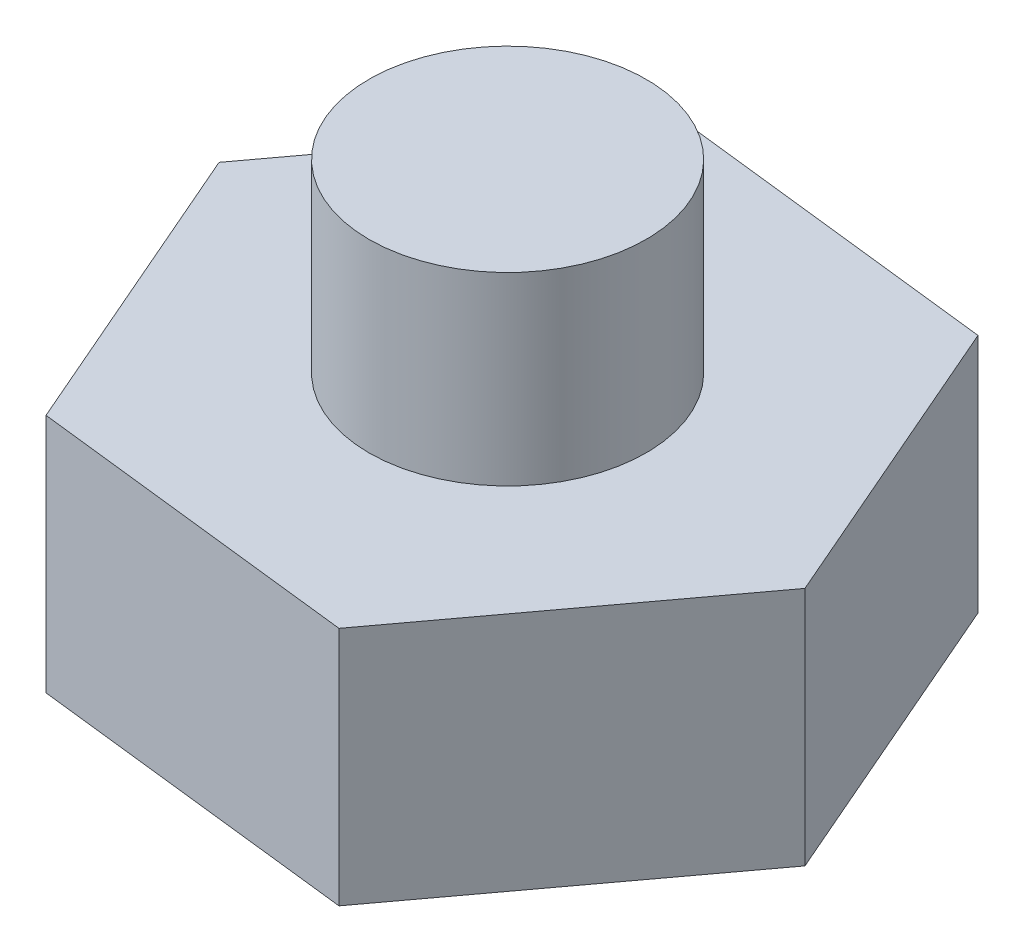
ISO-10303-21;
HEADER;
FILE_DESCRIPTION(('STEP AP214'),'2;1');
FILE_NAME('part.step','',(''),(''),'','','');
FILE_SCHEMA(('AUTOMOTIVE_DESIGN { 1 0 10303 214 1 1 1 1 }'));
ENDSEC;
DATA;
#1=APPLICATION_CONTEXT('core data for automotive mechanical design processes');
#2=APPLICATION_PROTOCOL_DEFINITION('international standard','automotive_design',2000,#1);
#3=PRODUCT_CONTEXT('',#1,'mechanical');
#4=PRODUCT('Part','Part','',(#3));
#5=PRODUCT_RELATED_PRODUCT_CATEGORY('part','',(#4));
#6=PRODUCT_DEFINITION_FORMATION('','',#4);
#7=PRODUCT_DEFINITION_CONTEXT('part definition',#1,'design');
#8=PRODUCT_DEFINITION('design','',#6,#7);
#9=PRODUCT_DEFINITION_SHAPE('','',#8);
#10=(LENGTH_UNIT() NAMED_UNIT(*) SI_UNIT(.MILLI.,.METRE.));
#11=(NAMED_UNIT(*) PLANE_ANGLE_UNIT() SI_UNIT($,.RADIAN.));
#12=(NAMED_UNIT(*) SI_UNIT($,.STERADIAN.) SOLID_ANGLE_UNIT());
#13=UNCERTAINTY_MEASURE_WITH_UNIT(LENGTH_MEASURE(1.E-05),#10,'distance_accuracy_value','');
#14=(GEOMETRIC_REPRESENTATION_CONTEXT(3) GLOBAL_UNCERTAINTY_ASSIGNED_CONTEXT((#13)) GLOBAL_UNIT_ASSIGNED_CONTEXT((#10,
#11,#12)) REPRESENTATION_CONTEXT('',''));
#15=CARTESIAN_POINT('',(0.,0.,0.));
#16=DIRECTION('',(0.,0.,1.));
#17=DIRECTION('',(1.,0.,0.));
#18=AXIS2_PLACEMENT_3D('',#15,#16,#17);
#19=CARTESIAN_POINT('',(0.,65.,0.));
#20=DIRECTION('',(0.,1.,0.));
#21=DIRECTION('',(0.,0.,1.));
#22=AXIS2_PLACEMENT_3D('',#19,#20,#21);
#23=PLANE('',#22);
#24=DIRECTION('',(0.993472129795685,0.,0.114075095087512));
#25=VECTOR('',#24,1.);
#26=CARTESIAN_POINT('',(-53.6499756463404,65.,72.3708703035115));
#27=LINE('',#26,#25);
#28=CARTESIAN_POINT('',(-53.6499756463404,65.,72.3708703035115));
#29=VERTEX_POINT('',#28);
#30=CARTESIAN_POINT('',(35.8500243536596,65.,82.647676973903));
#31=VERTEX_POINT('',#30);
#32=EDGE_CURVE('E129',#29,#31,#27,.T.);
#33=ORIENTED_EDGE('',*,*,#32,.T.);
#34=DIRECTION('',(0.595527995182753,0.,-0.803334554811139));
#35=VECTOR('',#34,1.);
#36=CARTESIAN_POINT('',(35.8500243536596,65.,82.647676973903));
#37=LINE('',#36,#35);
#38=CARTESIAN_POINT('',(89.5,65.,10.2768066703915));
#39=VERTEX_POINT('',#38);
#40=EDGE_CURVE('E87',#31,#39,#37,.T.);
#41=ORIENTED_EDGE('',*,*,#40,.T.);
#42=DIRECTION('',(-0.397944134612931,0.,-0.917409649898651));
#43=VECTOR('',#42,1.);
#44=CARTESIAN_POINT('',(89.5,65.,10.2768066703915));
#45=LINE('',#44,#43);
#46=CARTESIAN_POINT('',(53.6499756463405,65.,-72.3708703035115));
#47=VERTEX_POINT('',#46);
#48=EDGE_CURVE('E100',#39,#47,#45,.T.);
#49=ORIENTED_EDGE('',*,*,#48,.T.);
#50=DIRECTION('',(-0.993472129795685,0.,-0.114075095087512));
#51=VECTOR('',#50,1.);
#52=CARTESIAN_POINT('',(53.6499756463405,65.,-72.3708703035115));
#53=LINE('',#52,#51);
#54=CARTESIAN_POINT('',(-35.8500243536596,65.,-82.647676973903));
#55=VERTEX_POINT('',#54);
#56=EDGE_CURVE('E94',#47,#55,#53,.T.);
#57=ORIENTED_EDGE('',*,*,#56,.T.);
#58=DIRECTION('',(-0.595527995182753,0.,0.803334554811139));
#59=VECTOR('',#58,1.);
#60=CARTESIAN_POINT('',(-35.8500243536596,65.,-82.647676973903));
#61=LINE('',#60,#59);
#62=CARTESIAN_POINT('',(-89.5,65.,-10.2768066703915));
#63=VERTEX_POINT('',#62);
#64=EDGE_CURVE('E98',#55,#63,#61,.T.);
#65=ORIENTED_EDGE('',*,*,#64,.T.);
#66=DIRECTION('',(0.397944134612931,0.,0.917409649898651));
#67=VECTOR('',#66,1.);
#68=CARTESIAN_POINT('',(-89.5,65.,-10.2768066703915));
#69=LINE('',#68,#67);
#70=EDGE_CURVE('E50',#63,#29,#69,.T.);
#71=ORIENTED_EDGE('',*,*,#70,.T.);
#72=EDGE_LOOP('',(#33,#41,#49,#57,#65,#71));
#73=FACE_BOUND('',#72,.T.);
#74=CARTESIAN_POINT('',(-1.19152273757772,65.,0.));
#75=DIRECTION('',(0.,1.,0.));
#76=DIRECTION('',(0.,0.,1.));
#77=AXIS2_PLACEMENT_3D('',#74,#75,#76);
#78=CIRCLE('',#77,37.5);
#79=CARTESIAN_POINT('',(-1.19152273757772,65.,37.5));
#80=VERTEX_POINT('',#79);
#81=EDGE_CURVE('E122',#80,#80,#78,.T.);
#82=ORIENTED_EDGE('',*,*,#81,.F.);
#83=EDGE_LOOP('',(#82));
#84=FACE_BOUND('',#83,.T.);
#85=ADVANCED_FACE('F33',(#73,#84),#23,.T.);
#86=CARTESIAN_POINT('',(0.,0.,0.));
#87=DIRECTION('',(0.,1.,0.));
#88=DIRECTION('',(0.,0.,1.));
#89=AXIS2_PLACEMENT_3D('',#86,#87,#88);
#90=PLANE('',#89);
#91=DIRECTION('',(0.993472129795685,0.,0.114075095087512));
#92=VECTOR('',#91,1.);
#93=CARTESIAN_POINT('',(-53.6499756463404,0.,72.3708703035115));
#94=LINE('',#93,#92);
#95=CARTESIAN_POINT('',(-53.6499756463404,0.,72.3708703035115));
#96=VERTEX_POINT('',#95);
#97=CARTESIAN_POINT('',(35.8500243536596,0.,82.647676973903));
#98=VERTEX_POINT('',#97);
#99=EDGE_CURVE('E118',#96,#98,#94,.T.);
#100=ORIENTED_EDGE('',*,*,#99,.F.);
#101=DIRECTION('',(0.397944134612931,0.,0.917409649898651));
#102=VECTOR('',#101,1.);
#103=CARTESIAN_POINT('',(-89.5,0.,-10.2768066703915));
#104=LINE('',#103,#102);
#105=CARTESIAN_POINT('',(-89.5,0.,-10.2768066703915));
#106=VERTEX_POINT('',#105);
#107=EDGE_CURVE('E79',#106,#96,#104,.T.);
#108=ORIENTED_EDGE('',*,*,#107,.F.);
#109=DIRECTION('',(-0.595527995182753,0.,0.803334554811139));
#110=VECTOR('',#109,1.);
#111=CARTESIAN_POINT('',(-35.8500243536596,0.,-82.647676973903));
#112=LINE('',#111,#110);
#113=CARTESIAN_POINT('',(-35.8500243536596,0.,-82.647676973903));
#114=VERTEX_POINT('',#113);
#115=EDGE_CURVE('E73',#114,#106,#112,.T.);
#116=ORIENTED_EDGE('',*,*,#115,.F.);
#117=DIRECTION('',(-0.993472129795685,0.,-0.114075095087512));
#118=VECTOR('',#117,1.);
#119=CARTESIAN_POINT('',(53.6499756463405,0.,-72.3708703035115));
#120=LINE('',#119,#118);
#121=CARTESIAN_POINT('',(53.6499756463405,0.,-72.3708703035115));
#122=VERTEX_POINT('',#121);
#123=EDGE_CURVE('E108',#122,#114,#120,.T.);
#124=ORIENTED_EDGE('',*,*,#123,.F.);
#125=DIRECTION('',(-0.397944134612931,0.,-0.917409649898651));
#126=VECTOR('',#125,1.);
#127=CARTESIAN_POINT('',(89.5,0.,10.2768066703915));
#128=LINE('',#127,#126);
#129=CARTESIAN_POINT('',(89.5,0.,10.2768066703915));
#130=VERTEX_POINT('',#129);
#131=EDGE_CURVE('E124',#130,#122,#128,.T.);
#132=ORIENTED_EDGE('',*,*,#131,.F.);
#133=DIRECTION('',(0.595527995182753,0.,-0.803334554811139));
#134=VECTOR('',#133,1.);
#135=CARTESIAN_POINT('',(35.8500243536596,0.,82.647676973903));
#136=LINE('',#135,#134);
#137=EDGE_CURVE('E121',#98,#130,#136,.T.);
#138=ORIENTED_EDGE('',*,*,#137,.F.);
#139=EDGE_LOOP('',(#100,#108,#116,#124,#132,#138));
#140=FACE_BOUND('',#139,.T.);
#141=ADVANCED_FACE('F138',(#140),#90,.F.);
#142=CARTESIAN_POINT('',(-53.6499756463404,65.,72.3708703035115));
#143=DIRECTION('',(0.114075095087512,0.,-0.993472129795685));
#144=DIRECTION('',(-0.993472129795685,0.,-0.114075095087512));
#145=AXIS2_PLACEMENT_3D('',#142,#143,#144);
#146=PLANE('',#145);
#147=ORIENTED_EDGE('',*,*,#99,.T.);
#148=DIRECTION('',(0.,-1.,0.));
#149=VECTOR('',#148,1.);
#150=CARTESIAN_POINT('',(35.8500243536596,65.,82.647676973903));
#151=LINE('',#150,#149);
#152=EDGE_CURVE('E11',#31,#98,#151,.T.);
#153=ORIENTED_EDGE('',*,*,#152,.F.);
#154=ORIENTED_EDGE('',*,*,#32,.F.);
#155=DIRECTION('',(0.,-1.,0.));
#156=VECTOR('',#155,1.);
#157=CARTESIAN_POINT('',(-53.6499756463404,65.,72.3708703035115));
#158=LINE('',#157,#156);
#159=EDGE_CURVE('E114',#29,#96,#158,.T.);
#160=ORIENTED_EDGE('',*,*,#159,.T.);
#161=EDGE_LOOP('',(#147,#153,#154,#160));
#162=FACE_BOUND('',#161,.T.);
#163=ADVANCED_FACE('F35',(#162),#146,.F.);
#164=CARTESIAN_POINT('',(35.8500243536596,65.,82.647676973903));
#165=DIRECTION('',(-0.803334554811139,0.,-0.595527995182753));
#166=DIRECTION('',(-0.595527995182753,0.,0.803334554811139));
#167=AXIS2_PLACEMENT_3D('',#164,#165,#166);
#168=PLANE('',#167);
#169=ORIENTED_EDGE('',*,*,#137,.T.);
#170=DIRECTION('',(0.,-1.,0.));
#171=VECTOR('',#170,1.);
#172=CARTESIAN_POINT('',(89.5,65.,10.2768066703915));
#173=LINE('',#172,#171);
#174=EDGE_CURVE('E42',#39,#130,#173,.T.);
#175=ORIENTED_EDGE('',*,*,#174,.F.);
#176=ORIENTED_EDGE('',*,*,#40,.F.);
#177=ORIENTED_EDGE('',*,*,#152,.T.);
#178=EDGE_LOOP('',(#169,#175,#176,#177));
#179=FACE_BOUND('',#178,.T.);
#180=ADVANCED_FACE('F214',(#179),#168,.F.);
#181=CARTESIAN_POINT('',(89.5,65.,10.2768066703915));
#182=DIRECTION('',(-0.917409649898651,0.,0.397944134612931));
#183=DIRECTION('',(0.397944134612931,0.,0.917409649898651));
#184=AXIS2_PLACEMENT_3D('',#181,#182,#183);
#185=PLANE('',#184);
#186=ORIENTED_EDGE('',*,*,#131,.T.);
#187=DIRECTION('',(0.,-1.,0.));
#188=VECTOR('',#187,1.);
#189=CARTESIAN_POINT('',(53.6499756463405,65.,-72.3708703035115));
#190=LINE('',#189,#188);
#191=EDGE_CURVE('E109',#47,#122,#190,.T.);
#192=ORIENTED_EDGE('',*,*,#191,.F.);
#193=ORIENTED_EDGE('',*,*,#48,.F.);
#194=ORIENTED_EDGE('',*,*,#174,.T.);
#195=EDGE_LOOP('',(#186,#192,#193,#194));
#196=FACE_BOUND('',#195,.T.);
#197=ADVANCED_FACE('F135',(#196),#185,.F.);
#198=CARTESIAN_POINT('',(53.6499756463405,65.,-72.3708703035115));
#199=DIRECTION('',(-0.114075095087512,0.,0.993472129795685));
#200=DIRECTION('',(0.993472129795685,0.,0.114075095087512));
#201=AXIS2_PLACEMENT_3D('',#198,#199,#200);
#202=PLANE('',#201);
#203=ORIENTED_EDGE('',*,*,#123,.T.);
#204=DIRECTION('',(0.,-1.,0.));
#205=VECTOR('',#204,1.);
#206=CARTESIAN_POINT('',(-35.8500243536596,65.,-82.647676973903));
#207=LINE('',#206,#205);
#208=EDGE_CURVE('E105',#55,#114,#207,.T.);
#209=ORIENTED_EDGE('',*,*,#208,.F.);
#210=ORIENTED_EDGE('',*,*,#56,.F.);
#211=ORIENTED_EDGE('',*,*,#191,.T.);
#212=EDGE_LOOP('',(#203,#209,#210,#211));
#213=FACE_BOUND('',#212,.T.);
#214=ADVANCED_FACE('F106',(#213),#202,.F.);
#215=CARTESIAN_POINT('',(-35.8500243536596,65.,-82.647676973903));
#216=DIRECTION('',(0.803334554811139,0.,0.595527995182753));
#217=DIRECTION('',(0.595527995182753,0.,-0.803334554811139));
#218=AXIS2_PLACEMENT_3D('',#215,#216,#217);
#219=PLANE('',#218);
#220=ORIENTED_EDGE('',*,*,#115,.T.);
#221=DIRECTION('',(0.,-1.,0.));
#222=VECTOR('',#221,1.);
#223=CARTESIAN_POINT('',(-89.5,65.,-10.2768066703915));
#224=LINE('',#223,#222);
#225=EDGE_CURVE('E110',#63,#106,#224,.T.);
#226=ORIENTED_EDGE('',*,*,#225,.F.);
#227=ORIENTED_EDGE('',*,*,#64,.F.);
#228=ORIENTED_EDGE('',*,*,#208,.T.);
#229=EDGE_LOOP('',(#220,#226,#227,#228));
#230=FACE_BOUND('',#229,.T.);
#231=ADVANCED_FACE('F112',(#230),#219,.F.);
#232=CARTESIAN_POINT('',(-89.5,65.,-10.2768066703915));
#233=DIRECTION('',(0.917409649898651,0.,-0.397944134612931));
#234=DIRECTION('',(-0.397944134612931,0.,-0.917409649898651));
#235=AXIS2_PLACEMENT_3D('',#232,#233,#234);
#236=PLANE('',#235);
#237=ORIENTED_EDGE('',*,*,#107,.T.);
#238=ORIENTED_EDGE('',*,*,#159,.F.);
#239=ORIENTED_EDGE('',*,*,#70,.F.);
#240=ORIENTED_EDGE('',*,*,#225,.T.);
#241=EDGE_LOOP('',(#237,#238,#239,#240));
#242=FACE_BOUND('',#241,.T.);
#243=ADVANCED_FACE('F142',(#242),#236,.F.);
#244=CARTESIAN_POINT('',(-1.19152273757772,115.,0.));
#245=DIRECTION('',(0.,-1.,0.));
#246=DIRECTION('',(0.,0.,-1.));
#247=AXIS2_PLACEMENT_3D('',#244,#245,#246);
#248=CYLINDRICAL_SURFACE('',#247,37.5);
#249=ORIENTED_EDGE('',*,*,#81,.T.);
#250=EDGE_LOOP('',(#249));
#251=FACE_BOUND('',#250,.T.);
#252=CARTESIAN_POINT('',(-1.19152273757772,115.,0.));
#253=DIRECTION('',(0.,1.,0.));
#254=DIRECTION('',(0.,0.,1.));
#255=AXIS2_PLACEMENT_3D('',#252,#253,#254);
#256=CIRCLE('',#255,37.5);
#257=CARTESIAN_POINT('',(-1.19152273757772,115.,37.5));
#258=VERTEX_POINT('',#257);
#259=EDGE_CURVE('E167',#258,#258,#256,.T.);
#260=ORIENTED_EDGE('',*,*,#259,.F.);
#261=EDGE_LOOP('',(#260));
#262=FACE_BOUND('',#261,.T.);
#263=ADVANCED_FACE('F144',(#251,#262),#248,.T.);
#264=CARTESIAN_POINT('',(0.,115.,0.));
#265=DIRECTION('',(0.,1.,0.));
#266=DIRECTION('',(0.,0.,1.));
#267=AXIS2_PLACEMENT_3D('',#264,#265,#266);
#268=PLANE('',#267);
#269=ORIENTED_EDGE('',*,*,#259,.T.);
#270=EDGE_LOOP('',(#269));
#271=FACE_BOUND('',#270,.T.);
#272=ADVANCED_FACE('F150',(#271),#268,.T.);
#273=CLOSED_SHELL('',(#85,#141,#163,#180,#197,#214,#231,#243,#263,#272));
#274=MANIFOLD_SOLID_BREP('B2',#273);
#275=ADVANCED_BREP_SHAPE_REPRESENTATION('',(#18,#274),#14);
#276=SHAPE_DEFINITION_REPRESENTATION(#9,#275);
ENDSEC;
END-ISO-10303-21;
